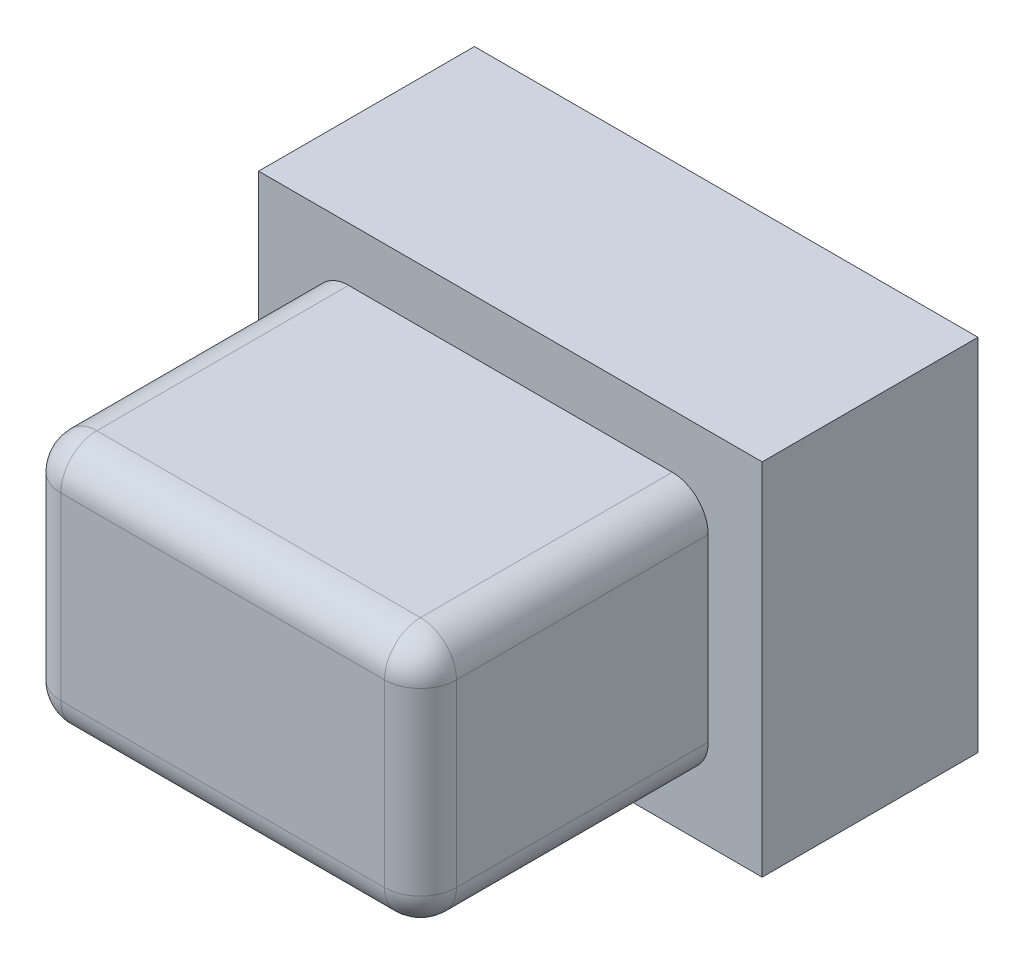
ISO-10303-21;
HEADER;
FILE_DESCRIPTION(('STEP AP214'),'2;1');
FILE_NAME('part.step','',(''),(''),'','','');
FILE_SCHEMA(('AUTOMOTIVE_DESIGN { 1 0 10303 214 1 1 1 1 }'));
ENDSEC;
DATA;
#1=APPLICATION_CONTEXT('core data for automotive mechanical design processes');
#2=APPLICATION_PROTOCOL_DEFINITION('international standard','automotive_design',2000,#1);
#3=PRODUCT_CONTEXT('',#1,'mechanical');
#4=PRODUCT('Part','Part','',(#3));
#5=PRODUCT_RELATED_PRODUCT_CATEGORY('part','',(#4));
#6=PRODUCT_DEFINITION_FORMATION('','',#4);
#7=PRODUCT_DEFINITION_CONTEXT('part definition',#1,'design');
#8=PRODUCT_DEFINITION('design','',#6,#7);
#9=PRODUCT_DEFINITION_SHAPE('','',#8);
#10=(LENGTH_UNIT() NAMED_UNIT(*) SI_UNIT(.MILLI.,.METRE.));
#11=(NAMED_UNIT(*) PLANE_ANGLE_UNIT() SI_UNIT($,.RADIAN.));
#12=(NAMED_UNIT(*) SI_UNIT($,.STERADIAN.) SOLID_ANGLE_UNIT());
#13=UNCERTAINTY_MEASURE_WITH_UNIT(LENGTH_MEASURE(1.E-05),#10,'distance_accuracy_value','');
#14=(GEOMETRIC_REPRESENTATION_CONTEXT(3) GLOBAL_UNCERTAINTY_ASSIGNED_CONTEXT((#13)) GLOBAL_UNIT_ASSIGNED_CONTEXT((#10,
#11,#12)) REPRESENTATION_CONTEXT('',''));
#15=CARTESIAN_POINT('',(0.,0.,0.));
#16=DIRECTION('',(0.,0.,1.));
#17=DIRECTION('',(1.,0.,0.));
#18=AXIS2_PLACEMENT_3D('',#15,#16,#17);
#19=CARTESIAN_POINT('',(3.5,2.5,3.));
#20=DIRECTION('',(-1.,0.,0.));
#21=DIRECTION('',(0.,0.,1.));
#22=AXIS2_PLACEMENT_3D('',#19,#20,#21);
#23=PLANE('',#22);
#24=DIRECTION('',(0.,1.,0.));
#25=VECTOR('',#24,1.);
#26=CARTESIAN_POINT('',(3.5,2.5,0.));
#27=LINE('',#26,#25);
#28=CARTESIAN_POINT('',(3.5,-2.5,0.));
#29=VERTEX_POINT('',#28);
#30=CARTESIAN_POINT('',(3.5,2.5,0.));
#31=VERTEX_POINT('',#30);
#32=EDGE_CURVE('E170',#29,#31,#27,.T.);
#33=ORIENTED_EDGE('',*,*,#32,.T.);
#34=DIRECTION('',(0.,0.,-1.));
#35=VECTOR('',#34,1.);
#36=CARTESIAN_POINT('',(3.5,2.5,3.));
#37=LINE('',#36,#35);
#38=CARTESIAN_POINT('',(3.5,2.5,3.));
#39=VERTEX_POINT('',#38);
#40=EDGE_CURVE('E149',#39,#31,#37,.T.);
#41=ORIENTED_EDGE('',*,*,#40,.F.);
#42=DIRECTION('',(0.,1.,0.));
#43=VECTOR('',#42,1.);
#44=CARTESIAN_POINT('',(3.5,2.5,3.));
#45=LINE('',#44,#43);
#46=CARTESIAN_POINT('',(3.5,-2.5,3.));
#47=VERTEX_POINT('',#46);
#48=EDGE_CURVE('E157',#47,#39,#45,.T.);
#49=ORIENTED_EDGE('',*,*,#48,.F.);
#50=DIRECTION('',(0.,0.,-1.));
#51=VECTOR('',#50,1.);
#52=CARTESIAN_POINT('',(3.5,-2.5,3.));
#53=LINE('',#52,#51);
#54=EDGE_CURVE('E404',#47,#29,#53,.T.);
#55=ORIENTED_EDGE('',*,*,#54,.T.);
#56=EDGE_LOOP('',(#33,#41,#49,#55));
#57=FACE_BOUND('',#56,.T.);
#58=ADVANCED_FACE('F41',(#57),#23,.F.);
#59=CARTESIAN_POINT('',(-3.5,2.5,3.));
#60=DIRECTION('',(0.,-1.,0.));
#61=DIRECTION('',(0.,0.,-1.));
#62=AXIS2_PLACEMENT_3D('',#59,#60,#61);
#63=PLANE('',#62);
#64=DIRECTION('',(-1.,0.,0.));
#65=VECTOR('',#64,1.);
#66=CARTESIAN_POINT('',(-3.5,2.5,0.));
#67=LINE('',#66,#65);
#68=CARTESIAN_POINT('',(-3.5,2.5,0.));
#69=VERTEX_POINT('',#68);
#70=EDGE_CURVE('E401',#31,#69,#67,.T.);
#71=ORIENTED_EDGE('',*,*,#70,.T.);
#72=DIRECTION('',(0.,0.,-1.));
#73=VECTOR('',#72,1.);
#74=CARTESIAN_POINT('',(-3.5,2.5,3.));
#75=LINE('',#74,#73);
#76=CARTESIAN_POINT('',(-3.5,2.5,3.));
#77=VERTEX_POINT('',#76);
#78=EDGE_CURVE('E152',#77,#69,#75,.T.);
#79=ORIENTED_EDGE('',*,*,#78,.F.);
#80=DIRECTION('',(-1.,0.,0.));
#81=VECTOR('',#80,1.);
#82=CARTESIAN_POINT('',(-3.5,2.5,3.));
#83=LINE('',#82,#81);
#84=EDGE_CURVE('E145',#39,#77,#83,.T.);
#85=ORIENTED_EDGE('',*,*,#84,.F.);
#86=ORIENTED_EDGE('',*,*,#40,.T.);
#87=EDGE_LOOP('',(#71,#79,#85,#86));
#88=FACE_BOUND('',#87,.T.);
#89=ADVANCED_FACE('F147',(#88),#63,.F.);
#90=CARTESIAN_POINT('',(-3.5,2.5,3.));
#91=DIRECTION('',(1.,0.,0.));
#92=DIRECTION('',(0.,1.,0.));
#93=AXIS2_PLACEMENT_3D('',#90,#91,#92);
#94=PLANE('',#93);
#95=DIRECTION('',(0.,-1.,0.));
#96=VECTOR('',#95,1.);
#97=CARTESIAN_POINT('',(-3.5,2.5,0.));
#98=LINE('',#97,#96);
#99=CARTESIAN_POINT('',(-3.5,-2.5,0.));
#100=VERTEX_POINT('',#99);
#101=EDGE_CURVE('E397',#69,#100,#98,.T.);
#102=ORIENTED_EDGE('',*,*,#101,.T.);
#103=DIRECTION('',(0.,0.,-1.));
#104=VECTOR('',#103,1.);
#105=CARTESIAN_POINT('',(-3.5,-2.5,3.));
#106=LINE('',#105,#104);
#107=CARTESIAN_POINT('',(-3.5,-2.5,3.));
#108=VERTEX_POINT('',#107);
#109=EDGE_CURVE('E179',#108,#100,#106,.T.);
#110=ORIENTED_EDGE('',*,*,#109,.F.);
#111=DIRECTION('',(0.,-1.,0.));
#112=VECTOR('',#111,1.);
#113=CARTESIAN_POINT('',(-3.5,2.5,3.));
#114=LINE('',#113,#112);
#115=EDGE_CURVE('E156',#77,#108,#114,.T.);
#116=ORIENTED_EDGE('',*,*,#115,.F.);
#117=ORIENTED_EDGE('',*,*,#78,.T.);
#118=EDGE_LOOP('',(#102,#110,#116,#117));
#119=FACE_BOUND('',#118,.T.);
#120=ADVANCED_FACE('F355',(#119),#94,.F.);
#121=CARTESIAN_POINT('',(-3.5,-2.5,3.));
#122=DIRECTION('',(0.,1.,0.));
#123=DIRECTION('',(0.,0.,1.));
#124=AXIS2_PLACEMENT_3D('',#121,#122,#123);
#125=PLANE('',#124);
#126=DIRECTION('',(1.,0.,0.));
#127=VECTOR('',#126,1.);
#128=CARTESIAN_POINT('',(-3.5,-2.5,0.));
#129=LINE('',#128,#127);
#130=EDGE_CURVE('E167',#100,#29,#129,.T.);
#131=ORIENTED_EDGE('',*,*,#130,.T.);
#132=ORIENTED_EDGE('',*,*,#54,.F.);
#133=DIRECTION('',(1.,0.,0.));
#134=VECTOR('',#133,1.);
#135=CARTESIAN_POINT('',(-3.5,-2.5,3.));
#136=LINE('',#135,#134);
#137=EDGE_CURVE('E162',#108,#47,#136,.T.);
#138=ORIENTED_EDGE('',*,*,#137,.F.);
#139=ORIENTED_EDGE('',*,*,#109,.T.);
#140=EDGE_LOOP('',(#131,#132,#138,#139));
#141=FACE_BOUND('',#140,.T.);
#142=ADVANCED_FACE('F385',(#141),#125,.F.);
#143=CARTESIAN_POINT('',(0.,0.,3.));
#144=DIRECTION('',(0.,0.,1.));
#145=DIRECTION('',(1.,0.,0.));
#146=AXIS2_PLACEMENT_3D('',#143,#144,#145);
#147=PLANE('',#146);
#148=DIRECTION('',(0.,1.,0.));
#149=VECTOR('',#148,1.);
#150=CARTESIAN_POINT('',(2.75,1.75,3.));
#151=LINE('',#150,#149);
#152=CARTESIAN_POINT('',(2.75,-1.25,3.));
#153=VERTEX_POINT('',#152);
#154=CARTESIAN_POINT('',(2.75,1.25,3.));
#155=VERTEX_POINT('',#154);
#156=EDGE_CURVE('E272',#153,#155,#151,.T.);
#157=ORIENTED_EDGE('',*,*,#156,.F.);
#158=CARTESIAN_POINT('',(2.25,-1.25,3.));
#159=DIRECTION('',(0.,0.,1.));
#160=DIRECTION('',(1.,0.,0.));
#161=AXIS2_PLACEMENT_3D('',#158,#159,#160);
#162=CIRCLE('',#161,0.5);
#163=CARTESIAN_POINT('',(2.25,-1.75,3.));
#164=VERTEX_POINT('',#163);
#165=EDGE_CURVE('E263',#153,#164,#162,.F.);
#166=ORIENTED_EDGE('',*,*,#165,.T.);
#167=DIRECTION('',(1.,0.,0.));
#168=VECTOR('',#167,1.);
#169=CARTESIAN_POINT('',(-2.75,-1.75,3.));
#170=LINE('',#169,#168);
#171=CARTESIAN_POINT('',(-2.25,-1.75,3.));
#172=VERTEX_POINT('',#171);
#173=EDGE_CURVE('E310',#172,#164,#170,.T.);
#174=ORIENTED_EDGE('',*,*,#173,.F.);
#175=CARTESIAN_POINT('',(-2.25,-1.25,3.));
#176=DIRECTION('',(0.,0.,1.));
#177=DIRECTION('',(1.,0.,0.));
#178=AXIS2_PLACEMENT_3D('',#175,#176,#177);
#179=CIRCLE('',#178,0.5);
#180=CARTESIAN_POINT('',(-2.75,-1.25,3.));
#181=VERTEX_POINT('',#180);
#182=EDGE_CURVE('E51',#172,#181,#179,.F.);
#183=ORIENTED_EDGE('',*,*,#182,.T.);
#184=DIRECTION('',(0.,-1.,0.));
#185=VECTOR('',#184,1.);
#186=CARTESIAN_POINT('',(-2.75,1.75,3.));
#187=LINE('',#186,#185);
#188=CARTESIAN_POINT('',(-2.75,1.25,3.));
#189=VERTEX_POINT('',#188);
#190=EDGE_CURVE('E298',#189,#181,#187,.T.);
#191=ORIENTED_EDGE('',*,*,#190,.F.);
#192=CARTESIAN_POINT('',(-2.25,1.25,3.));
#193=DIRECTION('',(0.,0.,1.));
#194=DIRECTION('',(1.,0.,0.));
#195=AXIS2_PLACEMENT_3D('',#192,#193,#194);
#196=CIRCLE('',#195,0.5);
#197=CARTESIAN_POINT('',(-2.25,1.75,3.));
#198=VERTEX_POINT('',#197);
#199=EDGE_CURVE('E11',#189,#198,#196,.F.);
#200=ORIENTED_EDGE('',*,*,#199,.T.);
#201=DIRECTION('',(-1.,0.,0.));
#202=VECTOR('',#201,1.);
#203=CARTESIAN_POINT('',(-2.75,1.75,3.));
#204=LINE('',#203,#202);
#205=CARTESIAN_POINT('',(2.25,1.75,3.));
#206=VERTEX_POINT('',#205);
#207=EDGE_CURVE('E421',#206,#198,#204,.T.);
#208=ORIENTED_EDGE('',*,*,#207,.F.);
#209=CARTESIAN_POINT('',(2.25,1.25,3.));
#210=DIRECTION('',(0.,0.,1.));
#211=DIRECTION('',(1.,0.,0.));
#212=AXIS2_PLACEMENT_3D('',#209,#210,#211);
#213=CIRCLE('',#212,0.5);
#214=EDGE_CURVE('E260',#206,#155,#213,.F.);
#215=ORIENTED_EDGE('',*,*,#214,.T.);
#216=EDGE_LOOP('',(#157,#166,#174,#183,#191,#200,#208,#215));
#217=FACE_BOUND('',#216,.T.);
#218=ORIENTED_EDGE('',*,*,#48,.T.);
#219=ORIENTED_EDGE('',*,*,#84,.T.);
#220=ORIENTED_EDGE('',*,*,#115,.T.);
#221=ORIENTED_EDGE('',*,*,#137,.T.);
#222=EDGE_LOOP('',(#218,#219,#220,#221));
#223=FACE_BOUND('',#222,.T.);
#224=ADVANCED_FACE('F160',(#217,#223),#147,.T.);
#225=CARTESIAN_POINT('',(0.,0.,0.));
#226=DIRECTION('',(0.,0.,1.));
#227=DIRECTION('',(1.,0.,0.));
#228=AXIS2_PLACEMENT_3D('',#225,#226,#227);
#229=PLANE('',#228);
#230=ORIENTED_EDGE('',*,*,#32,.F.);
#231=ORIENTED_EDGE('',*,*,#130,.F.);
#232=ORIENTED_EDGE('',*,*,#101,.F.);
#233=ORIENTED_EDGE('',*,*,#70,.F.);
#234=EDGE_LOOP('',(#230,#231,#232,#233));
#235=FACE_BOUND('',#234,.T.);
#236=ADVANCED_FACE('F381',(#235),#229,.F.);
#237=CARTESIAN_POINT('',(2.75,1.75,7.));
#238=DIRECTION('',(-1.,0.,0.));
#239=DIRECTION('',(0.,0.,1.));
#240=AXIS2_PLACEMENT_3D('',#237,#238,#239);
#241=PLANE('',#240);
#242=ORIENTED_EDGE('',*,*,#156,.T.);
#243=DIRECTION('',(0.,0.,-1.));
#244=VECTOR('',#243,1.);
#245=CARTESIAN_POINT('',(2.75,1.25,7.));
#246=LINE('',#245,#244);
#247=CARTESIAN_POINT('',(2.75,1.25,6.5));
#248=VERTEX_POINT('',#247);
#249=EDGE_CURVE('E246',#155,#248,#246,.F.);
#250=ORIENTED_EDGE('',*,*,#249,.T.);
#251=DIRECTION('',(0.,1.,0.));
#252=VECTOR('',#251,1.);
#253=CARTESIAN_POINT('',(2.75,-1.75,6.5));
#254=LINE('',#253,#252);
#255=CARTESIAN_POINT('',(2.75,-1.25,6.5));
#256=VERTEX_POINT('',#255);
#257=EDGE_CURVE('E205',#248,#256,#254,.F.);
#258=ORIENTED_EDGE('',*,*,#257,.T.);
#259=DIRECTION('',(0.,0.,-1.));
#260=VECTOR('',#259,1.);
#261=CARTESIAN_POINT('',(2.75,-1.25,7.));
#262=LINE('',#261,#260);
#263=EDGE_CURVE('E243',#256,#153,#262,.T.);
#264=ORIENTED_EDGE('',*,*,#263,.T.);
#265=EDGE_LOOP('',(#242,#250,#258,#264));
#266=FACE_BOUND('',#265,.T.);
#267=ADVANCED_FACE('F378',(#266),#241,.F.);
#268=CARTESIAN_POINT('',(-2.75,1.75,7.));
#269=DIRECTION('',(0.,-1.,0.));
#270=DIRECTION('',(1.,0.,0.));
#271=AXIS2_PLACEMENT_3D('',#268,#269,#270);
#272=PLANE('',#271);
#273=DIRECTION('',(-1.,0.,0.));
#274=VECTOR('',#273,1.);
#275=CARTESIAN_POINT('',(2.75,1.75,6.5));
#276=LINE('',#275,#274);
#277=CARTESIAN_POINT('',(-2.25,1.75,6.5));
#278=VERTEX_POINT('',#277);
#279=CARTESIAN_POINT('',(2.25,1.75,6.5));
#280=VERTEX_POINT('',#279);
#281=EDGE_CURVE('E201',#278,#280,#276,.F.);
#282=ORIENTED_EDGE('',*,*,#281,.T.);
#283=DIRECTION('',(0.,0.,-1.));
#284=VECTOR('',#283,1.);
#285=CARTESIAN_POINT('',(2.25,1.75,7.));
#286=LINE('',#285,#284);
#287=EDGE_CURVE('E240',#280,#206,#286,.T.);
#288=ORIENTED_EDGE('',*,*,#287,.T.);
#289=ORIENTED_EDGE('',*,*,#207,.T.);
#290=DIRECTION('',(0.,0.,-1.));
#291=VECTOR('',#290,1.);
#292=CARTESIAN_POINT('',(-2.25,1.75,7.));
#293=LINE('',#292,#291);
#294=EDGE_CURVE('E237',#198,#278,#293,.F.);
#295=ORIENTED_EDGE('',*,*,#294,.T.);
#296=EDGE_LOOP('',(#282,#288,#289,#295));
#297=FACE_BOUND('',#296,.T.);
#298=ADVANCED_FACE('F331',(#297),#272,.F.);
#299=CARTESIAN_POINT('',(-2.75,1.75,7.));
#300=DIRECTION('',(1.,0.,0.));
#301=DIRECTION('',(0.,0.,-1.));
#302=AXIS2_PLACEMENT_3D('',#299,#300,#301);
#303=PLANE('',#302);
#304=ORIENTED_EDGE('',*,*,#190,.T.);
#305=DIRECTION('',(0.,0.,-1.));
#306=VECTOR('',#305,1.);
#307=CARTESIAN_POINT('',(-2.75,-1.25,7.));
#308=LINE('',#307,#306);
#309=CARTESIAN_POINT('',(-2.75,-1.25,6.5));
#310=VERTEX_POINT('',#309);
#311=EDGE_CURVE('E257',#181,#310,#308,.F.);
#312=ORIENTED_EDGE('',*,*,#311,.T.);
#313=DIRECTION('',(0.,-1.,0.));
#314=VECTOR('',#313,1.);
#315=CARTESIAN_POINT('',(-2.75,1.75,6.5));
#316=LINE('',#315,#314);
#317=CARTESIAN_POINT('',(-2.75,1.25,6.5));
#318=VERTEX_POINT('',#317);
#319=EDGE_CURVE('E198',#310,#318,#316,.F.);
#320=ORIENTED_EDGE('',*,*,#319,.T.);
#321=DIRECTION('',(0.,0.,-1.));
#322=VECTOR('',#321,1.);
#323=CARTESIAN_POINT('',(-2.75,1.25,7.));
#324=LINE('',#323,#322);
#325=EDGE_CURVE('E65',#318,#189,#324,.T.);
#326=ORIENTED_EDGE('',*,*,#325,.T.);
#327=EDGE_LOOP('',(#304,#312,#320,#326));
#328=FACE_BOUND('',#327,.T.);
#329=ADVANCED_FACE('F296',(#328),#303,.F.);
#330=CARTESIAN_POINT('',(-2.75,-1.75,7.));
#331=DIRECTION('',(0.,1.,0.));
#332=DIRECTION('',(0.,0.,1.));
#333=AXIS2_PLACEMENT_3D('',#330,#331,#332);
#334=PLANE('',#333);
#335=ORIENTED_EDGE('',*,*,#173,.T.);
#336=DIRECTION('',(0.,0.,-1.));
#337=VECTOR('',#336,1.);
#338=CARTESIAN_POINT('',(2.25,-1.75,7.));
#339=LINE('',#338,#337);
#340=CARTESIAN_POINT('',(2.25,-1.75,6.5));
#341=VERTEX_POINT('',#340);
#342=EDGE_CURVE('E252',#164,#341,#339,.F.);
#343=ORIENTED_EDGE('',*,*,#342,.T.);
#344=DIRECTION('',(1.,0.,0.));
#345=VECTOR('',#344,1.);
#346=CARTESIAN_POINT('',(-2.75,-1.75,6.5));
#347=LINE('',#346,#345);
#348=CARTESIAN_POINT('',(-2.25,-1.75,6.5));
#349=VERTEX_POINT('',#348);
#350=EDGE_CURVE('E194',#341,#349,#347,.F.);
#351=ORIENTED_EDGE('',*,*,#350,.T.);
#352=DIRECTION('',(0.,0.,-1.));
#353=VECTOR('',#352,1.);
#354=CARTESIAN_POINT('',(-2.25,-1.75,7.));
#355=LINE('',#354,#353);
#356=EDGE_CURVE('E249',#349,#172,#355,.T.);
#357=ORIENTED_EDGE('',*,*,#356,.T.);
#358=EDGE_LOOP('',(#335,#343,#351,#357));
#359=FACE_BOUND('',#358,.T.);
#360=ADVANCED_FACE('F308',(#359),#334,.F.);
#361=CARTESIAN_POINT('',(0.,0.,7.));
#362=DIRECTION('',(0.,0.,1.));
#363=DIRECTION('',(1.,0.,0.));
#364=AXIS2_PLACEMENT_3D('',#361,#362,#363);
#365=PLANE('',#364);
#366=DIRECTION('',(0.,-1.,0.));
#367=VECTOR('',#366,1.);
#368=CARTESIAN_POINT('',(-2.25,-1.75,7.));
#369=LINE('',#368,#367);
#370=CARTESIAN_POINT('',(-2.25,1.25,7.));
#371=VERTEX_POINT('',#370);
#372=CARTESIAN_POINT('',(-2.25,-1.25,7.));
#373=VERTEX_POINT('',#372);
#374=EDGE_CURVE('E186',#371,#373,#369,.T.);
#375=ORIENTED_EDGE('',*,*,#374,.T.);
#376=DIRECTION('',(1.,0.,0.));
#377=VECTOR('',#376,1.);
#378=CARTESIAN_POINT('',(2.75,-1.25,7.));
#379=LINE('',#378,#377);
#380=CARTESIAN_POINT('',(2.25,-1.25,7.));
#381=VERTEX_POINT('',#380);
#382=EDGE_CURVE('E190',#373,#381,#379,.T.);
#383=ORIENTED_EDGE('',*,*,#382,.T.);
#384=DIRECTION('',(0.,1.,0.));
#385=VECTOR('',#384,1.);
#386=CARTESIAN_POINT('',(2.25,1.75,7.));
#387=LINE('',#386,#385);
#388=CARTESIAN_POINT('',(2.25,1.25,7.));
#389=VERTEX_POINT('',#388);
#390=EDGE_CURVE('E172',#381,#389,#387,.T.);
#391=ORIENTED_EDGE('',*,*,#390,.T.);
#392=DIRECTION('',(-1.,0.,0.));
#393=VECTOR('',#392,1.);
#394=CARTESIAN_POINT('',(-2.75,1.25,7.));
#395=LINE('',#394,#393);
#396=EDGE_CURVE('E177',#389,#371,#395,.T.);
#397=ORIENTED_EDGE('',*,*,#396,.T.);
#398=EDGE_LOOP('',(#375,#383,#391,#397));
#399=FACE_BOUND('',#398,.T.);
#400=ADVANCED_FACE('F325',(#399),#365,.T.);
#401=CARTESIAN_POINT('',(0.,1.25,6.5));
#402=DIRECTION('',(1.,0.,0.));
#403=DIRECTION('',(0.,1.,0.));
#404=AXIS2_PLACEMENT_3D('',#401,#402,#403);
#405=CYLINDRICAL_SURFACE('',#404,0.5);
#406=ORIENTED_EDGE('',*,*,#396,.F.);
#407=CARTESIAN_POINT('',(2.25,1.25,6.5));
#408=DIRECTION('',(1.,0.,0.));
#409=DIRECTION('',(0.,1.,0.));
#410=AXIS2_PLACEMENT_3D('',#407,#408,#409);
#411=CIRCLE('',#410,0.5);
#412=EDGE_CURVE('E219',#389,#280,#411,.F.);
#413=ORIENTED_EDGE('',*,*,#412,.T.);
#414=ORIENTED_EDGE('',*,*,#281,.F.);
#415=CARTESIAN_POINT('',(-2.25,1.25,6.5));
#416=DIRECTION('',(1.,0.,0.));
#417=DIRECTION('',(0.,1.,0.));
#418=AXIS2_PLACEMENT_3D('',#415,#416,#417);
#419=CIRCLE('',#418,0.5);
#420=EDGE_CURVE('E216',#278,#371,#419,.T.);
#421=ORIENTED_EDGE('',*,*,#420,.T.);
#422=EDGE_LOOP('',(#406,#413,#414,#421));
#423=FACE_BOUND('',#422,.T.);
#424=ADVANCED_FACE('F327',(#423),#405,.T.);
#425=CARTESIAN_POINT('',(-2.25,0.,6.5));
#426=DIRECTION('',(0.,1.,0.));
#427=DIRECTION('',(0.,0.,1.));
#428=AXIS2_PLACEMENT_3D('',#425,#426,#427);
#429=CYLINDRICAL_SURFACE('',#428,0.5);
#430=ORIENTED_EDGE('',*,*,#319,.F.);
#431=CARTESIAN_POINT('',(-2.25,-1.25,6.5));
#432=DIRECTION('',(0.,1.,0.));
#433=DIRECTION('',(0.,0.,1.));
#434=AXIS2_PLACEMENT_3D('',#431,#432,#433);
#435=CIRCLE('',#434,0.5);
#436=EDGE_CURVE('E234',#310,#373,#435,.T.);
#437=ORIENTED_EDGE('',*,*,#436,.T.);
#438=ORIENTED_EDGE('',*,*,#374,.F.);
#439=CARTESIAN_POINT('',(-2.25,1.25,6.5));
#440=DIRECTION('',(0.,1.,0.));
#441=DIRECTION('',(0.,0.,1.));
#442=AXIS2_PLACEMENT_3D('',#439,#440,#441);
#443=CIRCLE('',#442,0.5);
#444=EDGE_CURVE('E230',#371,#318,#443,.F.);
#445=ORIENTED_EDGE('',*,*,#444,.T.);
#446=EDGE_LOOP('',(#430,#437,#438,#445));
#447=FACE_BOUND('',#446,.T.);
#448=ADVANCED_FACE('F295',(#447),#429,.T.);
#449=CARTESIAN_POINT('',(2.25,0.,6.5));
#450=DIRECTION('',(0.,-1.,0.));
#451=DIRECTION('',(0.,0.,-1.));
#452=AXIS2_PLACEMENT_3D('',#449,#450,#451);
#453=CYLINDRICAL_SURFACE('',#452,0.5);
#454=ORIENTED_EDGE('',*,*,#257,.F.);
#455=CARTESIAN_POINT('',(2.25,1.25,6.5));
#456=DIRECTION('',(0.,-1.,0.));
#457=DIRECTION('',(0.,0.,-1.));
#458=AXIS2_PLACEMENT_3D('',#455,#456,#457);
#459=CIRCLE('',#458,0.5);
#460=EDGE_CURVE('E212',#248,#389,#459,.T.);
#461=ORIENTED_EDGE('',*,*,#460,.T.);
#462=ORIENTED_EDGE('',*,*,#390,.F.);
#463=CARTESIAN_POINT('',(2.25,-1.25,6.5));
#464=DIRECTION('',(0.,-1.,0.));
#465=DIRECTION('',(0.,0.,-1.));
#466=AXIS2_PLACEMENT_3D('',#463,#464,#465);
#467=CIRCLE('',#466,0.5);
#468=EDGE_CURVE('E209',#381,#256,#467,.F.);
#469=ORIENTED_EDGE('',*,*,#468,.T.);
#470=EDGE_LOOP('',(#454,#461,#462,#469));
#471=FACE_BOUND('',#470,.T.);
#472=ADVANCED_FACE('F321',(#471),#453,.T.);
#473=CARTESIAN_POINT('',(0.,-1.25,6.5));
#474=DIRECTION('',(-1.,0.,0.));
#475=DIRECTION('',(0.,0.,1.));
#476=AXIS2_PLACEMENT_3D('',#473,#474,#475);
#477=CYLINDRICAL_SURFACE('',#476,0.5);
#478=ORIENTED_EDGE('',*,*,#350,.F.);
#479=CARTESIAN_POINT('',(2.25,-1.25,6.5));
#480=DIRECTION('',(-1.,0.,0.));
#481=DIRECTION('',(0.,0.,1.));
#482=AXIS2_PLACEMENT_3D('',#479,#480,#481);
#483=CIRCLE('',#482,0.5);
#484=EDGE_CURVE('E226',#341,#381,#483,.T.);
#485=ORIENTED_EDGE('',*,*,#484,.T.);
#486=ORIENTED_EDGE('',*,*,#382,.F.);
#487=CARTESIAN_POINT('',(-2.25,-1.25,6.5));
#488=DIRECTION('',(-1.,0.,0.));
#489=DIRECTION('',(0.,0.,1.));
#490=AXIS2_PLACEMENT_3D('',#487,#488,#489);
#491=CIRCLE('',#490,0.5);
#492=EDGE_CURVE('E222',#373,#349,#491,.F.);
#493=ORIENTED_EDGE('',*,*,#492,.T.);
#494=EDGE_LOOP('',(#478,#485,#486,#493));
#495=FACE_BOUND('',#494,.T.);
#496=ADVANCED_FACE('F306',(#495),#477,.T.);
#497=CARTESIAN_POINT('',(2.25,1.25,7.));
#498=DIRECTION('',(0.,0.,-1.));
#499=DIRECTION('',(-1.,0.,0.));
#500=AXIS2_PLACEMENT_3D('',#497,#498,#499);
#501=CYLINDRICAL_SURFACE('',#500,0.5);
#502=ORIENTED_EDGE('',*,*,#214,.F.);
#503=ORIENTED_EDGE('',*,*,#287,.F.);
#504=CARTESIAN_POINT('',(2.25,1.25,6.5));
#505=DIRECTION('',(0.,0.,1.));
#506=DIRECTION('',(1.,0.,0.));
#507=AXIS2_PLACEMENT_3D('',#504,#505,#506);
#508=CIRCLE('',#507,0.5);
#509=EDGE_CURVE('E268',#248,#280,#508,.T.);
#510=ORIENTED_EDGE('',*,*,#509,.F.);
#511=ORIENTED_EDGE('',*,*,#249,.F.);
#512=EDGE_LOOP('',(#502,#503,#510,#511));
#513=FACE_BOUND('',#512,.T.);
#514=ADVANCED_FACE('F337',(#513),#501,.T.);
#515=CARTESIAN_POINT('',(2.25,1.25,6.5));
#516=DIRECTION('',(0.,0.,1.));
#517=DIRECTION('',(1.,0.,0.));
#518=AXIS2_PLACEMENT_3D('',#515,#516,#517);
#519=SPHERICAL_SURFACE('',#518,0.5);
#520=ORIENTED_EDGE('',*,*,#509,.T.);
#521=ORIENTED_EDGE('',*,*,#412,.F.);
#522=ORIENTED_EDGE('',*,*,#460,.F.);
#523=EDGE_LOOP('',(#520,#521,#522));
#524=FACE_BOUND('',#523,.T.);
#525=ADVANCED_FACE('F340',(#524),#519,.T.);
#526=CARTESIAN_POINT('',(2.25,-1.25,7.));
#527=DIRECTION('',(0.,0.,-1.));
#528=DIRECTION('',(-1.,0.,0.));
#529=AXIS2_PLACEMENT_3D('',#526,#527,#528);
#530=CYLINDRICAL_SURFACE('',#529,0.5);
#531=ORIENTED_EDGE('',*,*,#165,.F.);
#532=ORIENTED_EDGE('',*,*,#263,.F.);
#533=CARTESIAN_POINT('',(2.25,-1.25,6.5));
#534=DIRECTION('',(0.,0.,1.));
#535=DIRECTION('',(1.,0.,0.));
#536=AXIS2_PLACEMENT_3D('',#533,#534,#535);
#537=CIRCLE('',#536,0.5);
#538=EDGE_CURVE('E273',#341,#256,#537,.T.);
#539=ORIENTED_EDGE('',*,*,#538,.F.);
#540=ORIENTED_EDGE('',*,*,#342,.F.);
#541=EDGE_LOOP('',(#531,#532,#539,#540));
#542=FACE_BOUND('',#541,.T.);
#543=ADVANCED_FACE('F313',(#542),#530,.T.);
#544=CARTESIAN_POINT('',(2.25,-1.25,6.5));
#545=DIRECTION('',(0.,0.,1.));
#546=DIRECTION('',(1.,0.,0.));
#547=AXIS2_PLACEMENT_3D('',#544,#545,#546);
#548=SPHERICAL_SURFACE('',#547,0.5);
#549=ORIENTED_EDGE('',*,*,#538,.T.);
#550=ORIENTED_EDGE('',*,*,#468,.F.);
#551=ORIENTED_EDGE('',*,*,#484,.F.);
#552=EDGE_LOOP('',(#549,#550,#551));
#553=FACE_BOUND('',#552,.T.);
#554=ADVANCED_FACE('F317',(#553),#548,.T.);
#555=CARTESIAN_POINT('',(-2.25,-1.25,7.));
#556=DIRECTION('',(0.,0.,-1.));
#557=DIRECTION('',(-1.,0.,0.));
#558=AXIS2_PLACEMENT_3D('',#555,#556,#557);
#559=CYLINDRICAL_SURFACE('',#558,0.5);
#560=ORIENTED_EDGE('',*,*,#182,.F.);
#561=ORIENTED_EDGE('',*,*,#356,.F.);
#562=CARTESIAN_POINT('',(-2.25,-1.25,6.5));
#563=DIRECTION('',(0.,0.,1.));
#564=DIRECTION('',(1.,0.,0.));
#565=AXIS2_PLACEMENT_3D('',#562,#563,#564);
#566=CIRCLE('',#565,0.5);
#567=EDGE_CURVE('E276',#310,#349,#566,.T.);
#568=ORIENTED_EDGE('',*,*,#567,.F.);
#569=ORIENTED_EDGE('',*,*,#311,.F.);
#570=EDGE_LOOP('',(#560,#561,#568,#569));
#571=FACE_BOUND('',#570,.T.);
#572=ADVANCED_FACE('F300',(#571),#559,.T.);
#573=CARTESIAN_POINT('',(-2.25,-1.25,6.5));
#574=DIRECTION('',(0.,0.,1.));
#575=DIRECTION('',(1.,0.,0.));
#576=AXIS2_PLACEMENT_3D('',#573,#574,#575);
#577=SPHERICAL_SURFACE('',#576,0.5);
#578=ORIENTED_EDGE('',*,*,#492,.F.);
#579=ORIENTED_EDGE('',*,*,#436,.F.);
#580=ORIENTED_EDGE('',*,*,#567,.T.);
#581=EDGE_LOOP('',(#578,#579,#580));
#582=FACE_BOUND('',#581,.T.);
#583=ADVANCED_FACE('F519',(#582),#577,.T.);
#584=CARTESIAN_POINT('',(-2.25,1.25,7.));
#585=DIRECTION('',(0.,0.,-1.));
#586=DIRECTION('',(-1.,0.,0.));
#587=AXIS2_PLACEMENT_3D('',#584,#585,#586);
#588=CYLINDRICAL_SURFACE('',#587,0.5);
#589=ORIENTED_EDGE('',*,*,#199,.F.);
#590=ORIENTED_EDGE('',*,*,#325,.F.);
#591=CARTESIAN_POINT('',(-2.25,1.25,6.5));
#592=DIRECTION('',(0.,0.,1.));
#593=DIRECTION('',(1.,0.,0.));
#594=AXIS2_PLACEMENT_3D('',#591,#592,#593);
#595=CIRCLE('',#594,0.5);
#596=EDGE_CURVE('E45',#278,#318,#595,.T.);
#597=ORIENTED_EDGE('',*,*,#596,.F.);
#598=ORIENTED_EDGE('',*,*,#294,.F.);
#599=EDGE_LOOP('',(#589,#590,#597,#598));
#600=FACE_BOUND('',#599,.T.);
#601=ADVANCED_FACE('F43',(#600),#588,.T.);
#602=CARTESIAN_POINT('',(-2.25,1.25,6.5));
#603=DIRECTION('',(0.,0.,1.));
#604=DIRECTION('',(1.,0.,0.));
#605=AXIS2_PLACEMENT_3D('',#602,#603,#604);
#606=SPHERICAL_SURFACE('',#605,0.5);
#607=ORIENTED_EDGE('',*,*,#444,.F.);
#608=ORIENTED_EDGE('',*,*,#420,.F.);
#609=ORIENTED_EDGE('',*,*,#596,.T.);
#610=EDGE_LOOP('',(#607,#608,#609));
#611=FACE_BOUND('',#610,.T.);
#612=ADVANCED_FACE('F288',(#611),#606,.T.);
#613=CLOSED_SHELL('',(#58,#89,#120,#142,#224,#236,#267,#298,#329,#360,#400,#424,#448,#472,#496,
#514,#525,#543,#554,#572,#583,#601,#612));
#614=MANIFOLD_SOLID_BREP('B2',#613);
#615=ADVANCED_BREP_SHAPE_REPRESENTATION('',(#18,#614),#14);
#616=SHAPE_DEFINITION_REPRESENTATION(#9,#615);
ENDSEC;
END-ISO-10303-21;
